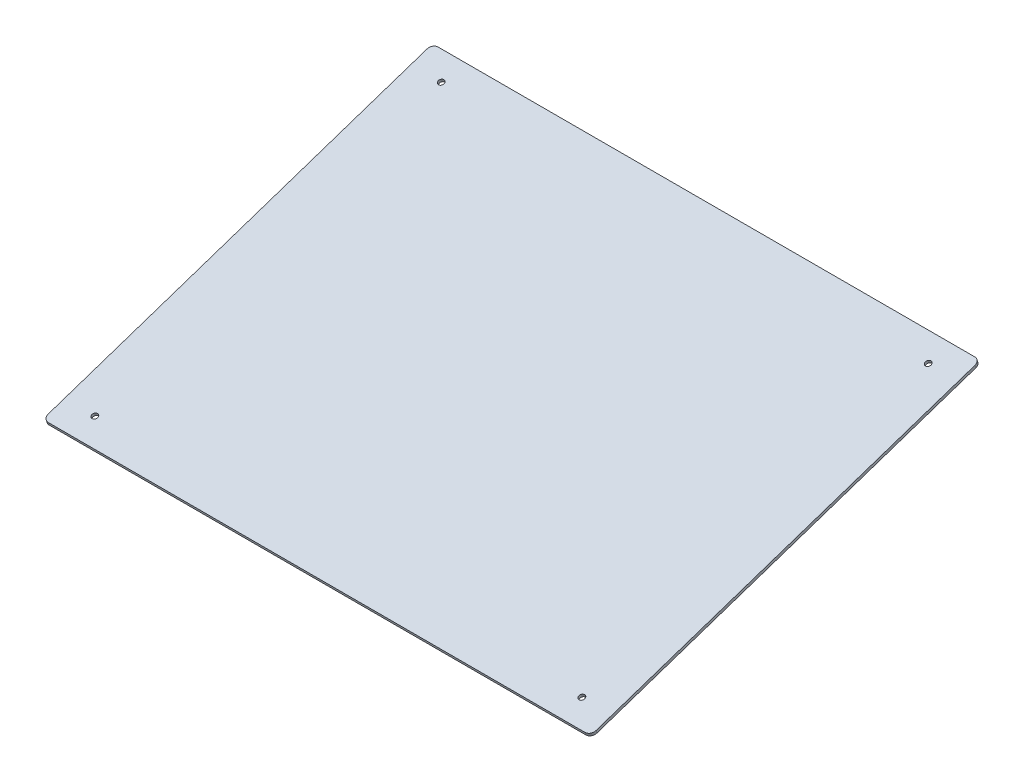
ISO-10303-21;
HEADER;
FILE_DESCRIPTION(('STEP AP214'),'2;1');
FILE_NAME('part.step','',(''),(''),'','','');
FILE_SCHEMA(('AUTOMOTIVE_DESIGN { 1 0 10303 214 1 1 1 1 }'));
ENDSEC;
DATA;
#1=APPLICATION_CONTEXT('core data for automotive mechanical design processes');
#2=APPLICATION_PROTOCOL_DEFINITION('international standard','automotive_design',2000,#1);
#3=PRODUCT_CONTEXT('',#1,'mechanical');
#4=PRODUCT('Part','Part','',(#3));
#5=PRODUCT_RELATED_PRODUCT_CATEGORY('part','',(#4));
#6=PRODUCT_DEFINITION_FORMATION('','',#4);
#7=PRODUCT_DEFINITION_CONTEXT('part definition',#1,'design');
#8=PRODUCT_DEFINITION('design','',#6,#7);
#9=PRODUCT_DEFINITION_SHAPE('','',#8);
#10=(LENGTH_UNIT() NAMED_UNIT(*) SI_UNIT(.MILLI.,.METRE.));
#11=(NAMED_UNIT(*) PLANE_ANGLE_UNIT() SI_UNIT($,.RADIAN.));
#12=(NAMED_UNIT(*) SI_UNIT($,.STERADIAN.) SOLID_ANGLE_UNIT());
#13=UNCERTAINTY_MEASURE_WITH_UNIT(LENGTH_MEASURE(1.E-05),#10,'distance_accuracy_value','');
#14=(GEOMETRIC_REPRESENTATION_CONTEXT(3) GLOBAL_UNCERTAINTY_ASSIGNED_CONTEXT((#13)) GLOBAL_UNIT_ASSIGNED_CONTEXT((#10,
#11,#12)) REPRESENTATION_CONTEXT('',''));
#15=CARTESIAN_POINT('',(0.,0.,0.));
#16=DIRECTION('',(0.,0.,1.));
#17=DIRECTION('',(1.,0.,0.));
#18=AXIS2_PLACEMENT_3D('',#15,#16,#17);
#19=CARTESIAN_POINT('',(304.8,75.5467720594824,-215.779345296051));
#20=DIRECTION('',(0.,0.317304656405086,-0.948323655206201));
#21=DIRECTION('',(0.,0.948323655206201,0.317304656405086));
#22=AXIS2_PLACEMENT_3D('',#19,#20,#21);
#23=PLANE('',#22);
#24=DIRECTION('',(1.,0.,0.));
#25=VECTOR('',#24,1.);
#26=CARTESIAN_POINT('',(304.8,72.5358444542027,-216.786787580138));
#27=LINE('',#26,#25);
#28=CARTESIAN_POINT('',(-298.45,72.5358444542028,-216.786787580138));
#29=VERTEX_POINT('',#28);
#30=CARTESIAN_POINT('',(298.45,72.5358444542027,-216.786787580138));
#31=VERTEX_POINT('',#30);
#32=EDGE_CURVE('E159',#29,#31,#27,.T.);
#33=ORIENTED_EDGE('',*,*,#32,.F.);
#34=DIRECTION('',(0.,-0.948323655206201,-0.317304656405086));
#35=VECTOR('',#34,1.);
#36=CARTESIAN_POINT('',(-298.45,75.5467720594825,-215.779345296052));
#37=LINE('',#36,#35);
#38=CARTESIAN_POINT('',(-298.45,75.5467720594825,-215.779345296052));
#39=VERTEX_POINT('',#38);
#40=EDGE_CURVE('E148',#29,#39,#37,.F.);
#41=ORIENTED_EDGE('',*,*,#40,.T.);
#42=DIRECTION('',(1.,0.,0.));
#43=VECTOR('',#42,1.);
#44=CARTESIAN_POINT('',(304.8,75.5467720594824,-215.779345296051));
#45=LINE('',#44,#43);
#46=CARTESIAN_POINT('',(298.45,75.5467720594824,-215.779345296051));
#47=VERTEX_POINT('',#46);
#48=EDGE_CURVE('E152',#39,#47,#45,.T.);
#49=ORIENTED_EDGE('',*,*,#48,.T.);
#50=DIRECTION('',(0.,-0.948323655206201,-0.317304656405086));
#51=VECTOR('',#50,1.);
#52=CARTESIAN_POINT('',(298.45,75.5467720594824,-215.779345296051));
#53=LINE('',#52,#51);
#54=EDGE_CURVE('E145',#47,#31,#53,.T.);
#55=ORIENTED_EDGE('',*,*,#54,.T.);
#56=EDGE_LOOP('',(#33,#41,#49,#55));
#57=FACE_BOUND('',#56,.T.);
#58=ADVANCED_FACE('F35',(#57),#23,.T.);
#59=CARTESIAN_POINT('',(-304.8,-69.5249168489231,217.794229864224));
#60=DIRECTION('',(-1.,0.,0.));
#61=DIRECTION('',(0.,0.,1.));
#62=AXIS2_PLACEMENT_3D('',#59,#60,#61);
#63=PLANE('',#62);
#64=DIRECTION('',(0.,0.317304656405087,-0.948323655206201));
#65=VECTOR('',#64,1.);
#66=CARTESIAN_POINT('',(-304.8,-72.5358444542027,216.786787580138));
#67=LINE('',#66,#65);
#68=CARTESIAN_POINT('',(-304.8,-70.5209598860304,210.764932369578));
#69=VERTEX_POINT('',#68);
#70=CARTESIAN_POINT('',(-304.8,70.5209598860306,-210.764932369578));
#71=VERTEX_POINT('',#70);
#72=EDGE_CURVE('E118',#69,#71,#67,.T.);
#73=ORIENTED_EDGE('',*,*,#72,.F.);
#74=DIRECTION('',(0.,-0.948323655206201,-0.317304656405086));
#75=VECTOR('',#74,1.);
#76=CARTESIAN_POINT('',(-304.8,-67.5100322807507,211.772374653664));
#77=LINE('',#76,#75);
#78=CARTESIAN_POINT('',(-304.8,-67.5100322807507,211.772374653664));
#79=VERTEX_POINT('',#78);
#80=EDGE_CURVE('E136',#69,#79,#77,.F.);
#81=ORIENTED_EDGE('',*,*,#80,.T.);
#82=DIRECTION('',(0.,0.317304656405087,-0.948323655206201));
#83=VECTOR('',#82,1.);
#84=CARTESIAN_POINT('',(-304.8,-69.5249168489231,217.794229864224));
#85=LINE('',#84,#83);
#86=CARTESIAN_POINT('',(-304.8,73.5318874913102,-209.757490085492));
#87=VERTEX_POINT('',#86);
#88=EDGE_CURVE('E120',#79,#87,#85,.T.);
#89=ORIENTED_EDGE('',*,*,#88,.T.);
#90=DIRECTION('',(0.,-0.948323655206201,-0.317304656405086));
#91=VECTOR('',#90,1.);
#92=CARTESIAN_POINT('',(-304.8,73.5318874913101,-209.757490085492));
#93=LINE('',#92,#91);
#94=EDGE_CURVE('E133',#87,#71,#93,.T.);
#95=ORIENTED_EDGE('',*,*,#94,.T.);
#96=EDGE_LOOP('',(#73,#81,#89,#95));
#97=FACE_BOUND('',#96,.T.);
#98=ADVANCED_FACE('F222',(#97),#63,.T.);
#99=CARTESIAN_POINT('',(304.8,-69.5249168489231,217.794229864224));
#100=DIRECTION('',(0.,-0.317304656405086,0.948323655206201));
#101=DIRECTION('',(0.,-0.948323655206201,-0.317304656405086));
#102=AXIS2_PLACEMENT_3D('',#99,#100,#101);
#103=PLANE('',#102);
#104=DIRECTION('',(-1.,0.,0.));
#105=VECTOR('',#104,1.);
#106=CARTESIAN_POINT('',(304.8,-69.5249168489231,217.794229864224));
#107=LINE('',#106,#105);
#108=CARTESIAN_POINT('',(298.45,-69.5249168489231,217.794229864224));
#109=VERTEX_POINT('',#108);
#110=CARTESIAN_POINT('',(-298.45,-69.5249168489231,217.794229864224));
#111=VERTEX_POINT('',#110);
#112=EDGE_CURVE('E124',#109,#111,#107,.T.);
#113=ORIENTED_EDGE('',*,*,#112,.T.);
#114=DIRECTION('',(0.,-0.948323655206201,-0.317304656405086));
#115=VECTOR('',#114,1.);
#116=CARTESIAN_POINT('',(-298.45,-69.5249168489231,217.794229864224));
#117=LINE('',#116,#115);
#118=CARTESIAN_POINT('',(-298.45,-72.5358444542027,216.786787580138));
#119=VERTEX_POINT('',#118);
#120=EDGE_CURVE('E110',#111,#119,#117,.T.);
#121=ORIENTED_EDGE('',*,*,#120,.T.);
#122=DIRECTION('',(-1.,0.,0.));
#123=VECTOR('',#122,1.);
#124=CARTESIAN_POINT('',(304.8,-72.5358444542028,216.786787580138));
#125=LINE('',#124,#123);
#126=CARTESIAN_POINT('',(298.45,-72.5358444542028,216.786787580138));
#127=VERTEX_POINT('',#126);
#128=EDGE_CURVE('E103',#127,#119,#125,.T.);
#129=ORIENTED_EDGE('',*,*,#128,.F.);
#130=DIRECTION('',(0.,-0.948323655206201,-0.317304656405086));
#131=VECTOR('',#130,1.);
#132=CARTESIAN_POINT('',(298.45,-69.5249168489231,217.794229864224));
#133=LINE('',#132,#131);
#134=EDGE_CURVE('E116',#127,#109,#133,.F.);
#135=ORIENTED_EDGE('',*,*,#134,.T.);
#136=EDGE_LOOP('',(#113,#121,#129,#135));
#137=FACE_BOUND('',#136,.T.);
#138=ADVANCED_FACE('F115',(#137),#103,.T.);
#139=CARTESIAN_POINT('',(304.8,-69.5249168489231,217.794229864224));
#140=DIRECTION('',(1.,0.,0.));
#141=DIRECTION('',(0.,0.,-1.));
#142=AXIS2_PLACEMENT_3D('',#139,#140,#141);
#143=PLANE('',#142);
#144=DIRECTION('',(0.,-0.317304656405087,0.948323655206201));
#145=VECTOR('',#144,1.);
#146=CARTESIAN_POINT('',(304.8,-72.5358444542028,216.786787580138));
#147=LINE('',#146,#145);
#148=CARTESIAN_POINT('',(304.8,70.5209598860306,-210.764932369578));
#149=VERTEX_POINT('',#148);
#150=CARTESIAN_POINT('',(304.8,-70.5209598860305,210.764932369578));
#151=VERTEX_POINT('',#150);
#152=EDGE_CURVE('E104',#149,#151,#147,.T.);
#153=ORIENTED_EDGE('',*,*,#152,.F.);
#154=DIRECTION('',(0.,-0.948323655206201,-0.317304656405086));
#155=VECTOR('',#154,1.);
#156=CARTESIAN_POINT('',(304.8,73.5318874913101,-209.757490085492));
#157=LINE('',#156,#155);
#158=CARTESIAN_POINT('',(304.8,73.5318874913102,-209.757490085492));
#159=VERTEX_POINT('',#158);
#160=EDGE_CURVE('E11',#149,#159,#157,.F.);
#161=ORIENTED_EDGE('',*,*,#160,.T.);
#162=DIRECTION('',(0.,-0.317304656405087,0.948323655206201));
#163=VECTOR('',#162,1.);
#164=CARTESIAN_POINT('',(304.8,-69.5249168489231,217.794229864224));
#165=LINE('',#164,#163);
#166=CARTESIAN_POINT('',(304.8,-67.5100322807508,211.772374653664));
#167=VERTEX_POINT('',#166);
#168=EDGE_CURVE('E150',#159,#167,#165,.T.);
#169=ORIENTED_EDGE('',*,*,#168,.T.);
#170=DIRECTION('',(0.,-0.948323655206201,-0.317304656405086));
#171=VECTOR('',#170,1.);
#172=CARTESIAN_POINT('',(304.8,-67.5100322807508,211.772374653664));
#173=LINE('',#172,#171);
#174=EDGE_CURVE('E43',#167,#151,#173,.T.);
#175=ORIENTED_EDGE('',*,*,#174,.T.);
#176=EDGE_LOOP('',(#153,#161,#169,#175));
#177=FACE_BOUND('',#176,.T.);
#178=ADVANCED_FACE('F149',(#177),#143,.T.);
#179=CARTESIAN_POINT('',(0.,3.01092760527969,1.00744228408615));
#180=DIRECTION('',(0.,-0.948323655206201,-0.317304656405086));
#181=DIRECTION('',(0.,0.317304656405086,-0.948323655206201));
#182=AXIS2_PLACEMENT_3D('',#179,#180,#181);
#183=PLANE('',#182);
#184=CARTESIAN_POINT('',(270.933333333333,67.4872337867933,-191.691924453814));
#185=DIRECTION('',(0.,-0.948323655206201,-0.317304656405086));
#186=DIRECTION('',(0.,-0.317304656405086,0.948323655206201));
#187=AXIS2_PLACEMENT_3D('',#184,#185,#186);
#188=CIRCLE('',#187,3.175);
#189=CARTESIAN_POINT('',(270.933333333333,68.4946760708794,-194.702852059094));
#190=VERTEX_POINT('',#189);
#191=EDGE_CURVE('E181',#190,#190,#188,.T.);
#192=ORIENTED_EDGE('',*,*,#191,.T.);
#193=EDGE_LOOP('',(#192));
#194=FACE_BOUND('',#193,.T.);
#195=CARTESIAN_POINT('',(270.933333333333,-61.4653785762338,193.706809021986));
#196=DIRECTION('',(0.,-0.948323655206201,-0.317304656405086));
#197=DIRECTION('',(0.,-0.317304656405086,0.948323655206201));
#198=AXIS2_PLACEMENT_3D('',#195,#196,#197);
#199=CIRCLE('',#198,3.17500000000024);
#200=CARTESIAN_POINT('',(270.933333333333,-60.4579362921476,190.695881416706));
#201=VERTEX_POINT('',#200);
#202=EDGE_CURVE('E175',#201,#201,#199,.T.);
#203=ORIENTED_EDGE('',*,*,#202,.T.);
#204=EDGE_LOOP('',(#203));
#205=FACE_BOUND('',#204,.T.);
#206=CARTESIAN_POINT('',(-270.933333333333,-61.4653785762338,193.706809021986));
#207=DIRECTION('',(0.,-0.948323655206201,-0.317304656405086));
#208=DIRECTION('',(0.,0.317304656405086,-0.948323655206201));
#209=AXIS2_PLACEMENT_3D('',#206,#207,#208);
#210=CIRCLE('',#209,3.17499999999997);
#211=CARTESIAN_POINT('',(-270.933333333333,-60.4579362921477,190.695881416706));
#212=VERTEX_POINT('',#211);
#213=EDGE_CURVE('E170',#212,#212,#210,.T.);
#214=ORIENTED_EDGE('',*,*,#213,.T.);
#215=EDGE_LOOP('',(#214));
#216=FACE_BOUND('',#215,.T.);
#217=CARTESIAN_POINT('',(-270.933333333333,67.4872337867933,-191.691924453814));
#218=DIRECTION('',(0.,-0.948323655206201,-0.317304656405086));
#219=DIRECTION('',(0.,0.317304656405086,-0.948323655206201));
#220=AXIS2_PLACEMENT_3D('',#217,#218,#219);
#221=CIRCLE('',#220,3.175);
#222=CARTESIAN_POINT('',(-270.933333333333,68.4946760708794,-194.702852059094));
#223=VERTEX_POINT('',#222);
#224=EDGE_CURVE('E162',#223,#223,#221,.T.);
#225=ORIENTED_EDGE('',*,*,#224,.T.);
#226=EDGE_LOOP('',(#225));
#227=FACE_BOUND('',#226,.T.);
#228=ORIENTED_EDGE('',*,*,#88,.F.);
#229=CARTESIAN_POINT('',(-298.45,-67.5100322807507,211.772374653664));
#230=DIRECTION('',(0.,-0.948323655206201,-0.317304656405086));
#231=DIRECTION('',(0.,0.317304656405086,-0.948323655206201));
#232=AXIS2_PLACEMENT_3D('',#229,#230,#231);
#233=CIRCLE('',#232,6.35);
#234=EDGE_CURVE('E143',#79,#111,#233,.F.);
#235=ORIENTED_EDGE('',*,*,#234,.T.);
#236=ORIENTED_EDGE('',*,*,#112,.F.);
#237=CARTESIAN_POINT('',(298.45,-67.5100322807508,211.772374653664));
#238=DIRECTION('',(0.,-0.948323655206201,-0.317304656405086));
#239=DIRECTION('',(0.,0.317304656405086,-0.948323655206201));
#240=AXIS2_PLACEMENT_3D('',#237,#238,#239);
#241=CIRCLE('',#240,6.35);
#242=EDGE_CURVE('E50',#109,#167,#241,.F.);
#243=ORIENTED_EDGE('',*,*,#242,.T.);
#244=ORIENTED_EDGE('',*,*,#168,.F.);
#245=CARTESIAN_POINT('',(298.45,73.5318874913101,-209.757490085492));
#246=DIRECTION('',(0.,-0.948323655206201,-0.317304656405086));
#247=DIRECTION('',(0.,0.317304656405086,-0.948323655206201));
#248=AXIS2_PLACEMENT_3D('',#245,#246,#247);
#249=CIRCLE('',#248,6.35);
#250=EDGE_CURVE('E139',#159,#47,#249,.F.);
#251=ORIENTED_EDGE('',*,*,#250,.T.);
#252=ORIENTED_EDGE('',*,*,#48,.F.);
#253=CARTESIAN_POINT('',(-298.45,73.5318874913102,-209.757490085492));
#254=DIRECTION('',(0.,-0.948323655206201,-0.317304656405086));
#255=DIRECTION('',(0.,0.317304656405086,-0.948323655206201));
#256=AXIS2_PLACEMENT_3D('',#253,#254,#255);
#257=CIRCLE('',#256,6.35);
#258=EDGE_CURVE('E141',#39,#87,#257,.F.);
#259=ORIENTED_EDGE('',*,*,#258,.T.);
#260=EDGE_LOOP('',(#228,#235,#236,#243,#244,#251,#252,#259));
#261=FACE_BOUND('',#260,.T.);
#262=ADVANCED_FACE('F190',(#194,#205,#216,#227,#261),#183,.F.);
#263=CARTESIAN_POINT('',(0.,0.,0.));
#264=DIRECTION('',(0.,-0.948323655206201,-0.317304656405086));
#265=DIRECTION('',(0.,0.317304656405086,-0.948323655206201));
#266=AXIS2_PLACEMENT_3D('',#263,#264,#265);
#267=PLANE('',#266);
#268=CARTESIAN_POINT('',(270.933333333333,64.4763061815136,-192.6993667379));
#269=DIRECTION('',(0.,-0.948323655206201,-0.317304656405086));
#270=DIRECTION('',(0.,-0.317304656405086,0.948323655206201));
#271=AXIS2_PLACEMENT_3D('',#268,#269,#270);
#272=CIRCLE('',#271,3.175);
#273=CARTESIAN_POINT('',(270.933333333333,65.4837484655997,-195.71029434318));
#274=VERTEX_POINT('',#273);
#275=EDGE_CURVE('E184',#274,#274,#272,.T.);
#276=ORIENTED_EDGE('',*,*,#275,.F.);
#277=EDGE_LOOP('',(#276));
#278=FACE_BOUND('',#277,.T.);
#279=CARTESIAN_POINT('',(270.933333333333,-64.4763061815135,192.6993667379));
#280=DIRECTION('',(0.,-0.948323655206201,-0.317304656405086));
#281=DIRECTION('',(0.,-0.317304656405086,0.948323655206201));
#282=AXIS2_PLACEMENT_3D('',#279,#280,#281);
#283=CIRCLE('',#282,3.17500000000024);
#284=CARTESIAN_POINT('',(270.933333333333,-63.4688638974273,189.68843913262));
#285=VERTEX_POINT('',#284);
#286=EDGE_CURVE('E178',#285,#285,#283,.T.);
#287=ORIENTED_EDGE('',*,*,#286,.F.);
#288=EDGE_LOOP('',(#287));
#289=FACE_BOUND('',#288,.T.);
#290=CARTESIAN_POINT('',(-270.933333333333,-64.4763061815135,192.6993667379));
#291=DIRECTION('',(0.,-0.948323655206201,-0.317304656405086));
#292=DIRECTION('',(0.,0.317304656405086,-0.948323655206201));
#293=AXIS2_PLACEMENT_3D('',#290,#291,#292);
#294=CIRCLE('',#293,3.17499999999997);
#295=CARTESIAN_POINT('',(-270.933333333333,-63.4688638974274,189.68843913262));
#296=VERTEX_POINT('',#295);
#297=EDGE_CURVE('E172',#296,#296,#294,.T.);
#298=ORIENTED_EDGE('',*,*,#297,.F.);
#299=EDGE_LOOP('',(#298));
#300=FACE_BOUND('',#299,.T.);
#301=CARTESIAN_POINT('',(-270.933333333333,64.4763061815136,-192.6993667379));
#302=DIRECTION('',(0.,-0.948323655206201,-0.317304656405086));
#303=DIRECTION('',(0.,0.317304656405086,-0.948323655206201));
#304=AXIS2_PLACEMENT_3D('',#301,#302,#303);
#305=CIRCLE('',#304,3.175);
#306=CARTESIAN_POINT('',(-270.933333333333,65.4837484655997,-195.71029434318));
#307=VERTEX_POINT('',#306);
#308=EDGE_CURVE('E165',#307,#307,#305,.T.);
#309=ORIENTED_EDGE('',*,*,#308,.F.);
#310=EDGE_LOOP('',(#309));
#311=FACE_BOUND('',#310,.T.);
#312=ORIENTED_EDGE('',*,*,#128,.T.);
#313=CARTESIAN_POINT('',(-298.45,-70.5209598860304,210.764932369578));
#314=DIRECTION('',(0.,-0.948323655206201,-0.317304656405086));
#315=DIRECTION('',(0.,0.317304656405086,-0.948323655206201));
#316=AXIS2_PLACEMENT_3D('',#313,#314,#315);
#317=CIRCLE('',#316,6.35);
#318=EDGE_CURVE('E131',#119,#69,#317,.T.);
#319=ORIENTED_EDGE('',*,*,#318,.T.);
#320=ORIENTED_EDGE('',*,*,#72,.T.);
#321=CARTESIAN_POINT('',(-298.45,70.5209598860305,-210.764932369578));
#322=DIRECTION('',(0.,-0.948323655206201,-0.317304656405086));
#323=DIRECTION('',(0.,0.317304656405086,-0.948323655206201));
#324=AXIS2_PLACEMENT_3D('',#321,#322,#323);
#325=CIRCLE('',#324,6.35);
#326=EDGE_CURVE('E129',#71,#29,#325,.T.);
#327=ORIENTED_EDGE('',*,*,#326,.T.);
#328=ORIENTED_EDGE('',*,*,#32,.T.);
#329=CARTESIAN_POINT('',(298.45,70.5209598860305,-210.764932369578));
#330=DIRECTION('',(0.,-0.948323655206201,-0.317304656405086));
#331=DIRECTION('',(0.,0.317304656405086,-0.948323655206201));
#332=AXIS2_PLACEMENT_3D('',#329,#330,#331);
#333=CIRCLE('',#332,6.35);
#334=EDGE_CURVE('E109',#31,#149,#333,.T.);
#335=ORIENTED_EDGE('',*,*,#334,.T.);
#336=ORIENTED_EDGE('',*,*,#152,.T.);
#337=CARTESIAN_POINT('',(298.45,-70.5209598860305,210.764932369578));
#338=DIRECTION('',(0.,-0.948323655206201,-0.317304656405086));
#339=DIRECTION('',(0.,0.317304656405086,-0.948323655206201));
#340=AXIS2_PLACEMENT_3D('',#337,#338,#339);
#341=CIRCLE('',#340,6.35);
#342=EDGE_CURVE('E100',#151,#127,#341,.T.);
#343=ORIENTED_EDGE('',*,*,#342,.T.);
#344=EDGE_LOOP('',(#312,#319,#320,#327,#328,#335,#336,#343));
#345=FACE_BOUND('',#344,.T.);
#346=ADVANCED_FACE('F102',(#278,#289,#300,#311,#345),#267,.T.);
#347=CARTESIAN_POINT('',(-270.933333333333,67.4872337867933,-191.691924453814));
#348=DIRECTION('',(0.,-0.948323655206201,-0.317304656405086));
#349=DIRECTION('',(0.,0.317304656405086,-0.948323655206201));
#350=AXIS2_PLACEMENT_3D('',#347,#348,#349);
#351=CYLINDRICAL_SURFACE('',#350,3.175);
#352=CARTESIAN_POINT('',(-270.933333333333,68.4946760708794,-194.702852059094));
#353=CARTESIAN_POINT('',(-270.933333333333,68.4633122416577,-194.713346249553));
#354=CARTESIAN_POINT('',(-270.933333333333,68.4319484124361,-194.723840440012));
#355=CARTESIAN_POINT('',(-270.933333333333,68.3692207539927,-194.744828820931));
#356=CARTESIAN_POINT('',(-270.933333333333,68.3378569247711,-194.75532301139));
#357=CARTESIAN_POINT('',(-270.933333333333,68.2751292663278,-194.776311392308));
#358=CARTESIAN_POINT('',(-270.933333333333,68.2437654371061,-194.786805582768));
#359=CARTESIAN_POINT('',(-270.933333333333,68.1810377786628,-194.807793963686));
#360=CARTESIAN_POINT('',(-270.933333333333,68.1496739494411,-194.818288154145));
#361=CARTESIAN_POINT('',(-270.933333333333,68.0869462909978,-194.839276535064));
#362=CARTESIAN_POINT('',(-270.933333333333,68.0555824617761,-194.849770725523));
#363=CARTESIAN_POINT('',(-270.933333333333,67.9928548033328,-194.870759106441));
#364=CARTESIAN_POINT('',(-270.933333333333,67.9614909741111,-194.881253296901));
#365=CARTESIAN_POINT('',(-270.933333333333,67.8987633156678,-194.902241677819));
#366=CARTESIAN_POINT('',(-270.933333333333,67.8673994864461,-194.912735868278));
#367=CARTESIAN_POINT('',(-270.933333333333,67.8046718280028,-194.933724249197));
#368=CARTESIAN_POINT('',(-270.933333333333,67.7733079987812,-194.944218439656));
#369=CARTESIAN_POINT('',(-270.933333333333,67.7105803403378,-194.965206820574));
#370=CARTESIAN_POINT('',(-270.933333333333,67.6792165111162,-194.975701011034));
#371=CARTESIAN_POINT('',(-270.933333333333,67.6164888526728,-194.996689391952));
#372=CARTESIAN_POINT('',(-270.933333333333,67.5851250234512,-195.007183582411));
#373=CARTESIAN_POINT('',(-270.933333333333,67.5223973650078,-195.02817196333));
#374=CARTESIAN_POINT('',(-270.933333333333,67.4910335357862,-195.038666153789));
#375=CARTESIAN_POINT('',(-270.933333333333,67.4283058773429,-195.059654534708));
#376=CARTESIAN_POINT('',(-270.933333333333,67.3969420481212,-195.070148725167));
#377=CARTESIAN_POINT('',(-270.933333333333,67.3342143896779,-195.091137106085));
#378=CARTESIAN_POINT('',(-270.933333333333,67.3028505604562,-195.101631296544));
#379=CARTESIAN_POINT('',(-270.933333333333,67.2401229020129,-195.122619677463));
#380=CARTESIAN_POINT('',(-270.933333333333,67.2087590727912,-195.133113867922));
#381=CARTESIAN_POINT('',(-270.933333333333,67.1460314143479,-195.154102248841));
#382=CARTESIAN_POINT('',(-270.933333333333,67.1146675851262,-195.1645964393));
#383=CARTESIAN_POINT('',(-270.933333333333,67.0519399266829,-195.185584820218));
#384=CARTESIAN_POINT('',(-270.933333333333,67.0205760974612,-195.196079010678));
#385=CARTESIAN_POINT('',(-270.933333333333,66.9578484390179,-195.217067391596));
#386=CARTESIAN_POINT('',(-270.933333333333,66.9264846097962,-195.227561582055));
#387=CARTESIAN_POINT('',(-270.933333333333,66.8637569513529,-195.248549962974));
#388=CARTESIAN_POINT('',(-270.933333333333,66.8323931221313,-195.259044153433));
#389=CARTESIAN_POINT('',(-270.933333333333,66.7696654636879,-195.280032534351));
#390=CARTESIAN_POINT('',(-270.933333333333,66.7383016344663,-195.290526724811));
#391=CARTESIAN_POINT('',(-270.933333333333,66.6755739760229,-195.311515105729));
#392=CARTESIAN_POINT('',(-270.933333333333,66.6442101468013,-195.322009296188));
#393=CARTESIAN_POINT('',(-270.933333333333,66.5814824883579,-195.342997677107));
#394=CARTESIAN_POINT('',(-270.933333333333,66.5501186591363,-195.353491867566));
#395=CARTESIAN_POINT('',(-270.933333333333,66.487391000693,-195.374480248484));
#396=CARTESIAN_POINT('',(-270.933333333333,66.4560271714713,-195.384974438944));
#397=CARTESIAN_POINT('',(-270.933333333333,66.393299513028,-195.405962819862));
#398=CARTESIAN_POINT('',(-270.933333333333,66.3619356838063,-195.416457010321));
#399=CARTESIAN_POINT('',(-270.933333333333,66.299208025363,-195.43744539124));
#400=CARTESIAN_POINT('',(-270.933333333333,66.2678441961413,-195.447939581699));
#401=CARTESIAN_POINT('',(-270.933333333333,66.205116537698,-195.468927962618));
#402=CARTESIAN_POINT('',(-270.933333333333,66.1737527084763,-195.479422153077));
#403=CARTESIAN_POINT('',(-270.933333333333,66.111025050033,-195.500410533995));
#404=CARTESIAN_POINT('',(-270.933333333333,66.0796612208113,-195.510904724454));
#405=CARTESIAN_POINT('',(-270.933333333333,66.016933562368,-195.531893105373));
#406=CARTESIAN_POINT('',(-270.933333333333,65.9855697331463,-195.542387295832));
#407=CARTESIAN_POINT('',(-270.933333333333,65.922842074703,-195.563375676751));
#408=CARTESIAN_POINT('',(-270.933333333333,65.8914782454814,-195.57386986721));
#409=CARTESIAN_POINT('',(-270.933333333333,65.828750587038,-195.594858248128));
#410=CARTESIAN_POINT('',(-270.933333333333,65.7973867578164,-195.605352438588));
#411=CARTESIAN_POINT('',(-270.933333333333,65.734659099373,-195.626340819506));
#412=CARTESIAN_POINT('',(-270.933333333333,65.7032952701514,-195.636835009965));
#413=CARTESIAN_POINT('',(-270.933333333333,65.640567611708,-195.657823390884));
#414=CARTESIAN_POINT('',(-270.933333333333,65.6092037824864,-195.668317581343));
#415=CARTESIAN_POINT('',(-270.933333333333,65.546476124043,-195.689305962261));
#416=CARTESIAN_POINT('',(-270.933333333333,65.5151122948214,-195.699800152721));
#417=CARTESIAN_POINT('',(-270.933333333333,65.4837484655997,-195.71029434318));
#418=B_SPLINE_CURVE_WITH_KNOTS('',3,(#352,#353,#354,#355,#356,#357,#358,#359,#360,#361,#362,
#363,#364,#365,#366,#367,#368,#369,#370,#371,#372,#373,#374,#375,#376,#377,#378,#379,#380,#381,
#382,#383,#384,#385,#386,#387,#388,#389,#390,#391,#392,#393,#394,#395,#396,#397,#398,#399,#400,
#401,#402,#403,#404,#405,#406,#407,#408,#409,#410,#411,#412,#413,#414,#415,#416,#417),
.UNSPECIFIED.,.F.,.F.,(4,2,2,2,2,2,2,2,2,2,2,2,2,2,2,2,2,2,2,2,2,2,2,2,2,2,2,2,2,2,2,2,4),(0.,
0.0992187499999932,0.1984375,0.297656249999993,0.396874999999999,0.496093749999992,
0.595312499999999,0.694531249999983,0.793749999999989,0.892968749999996,0.992187499999989,
1.09140625,1.19062499999999,1.28984375,1.38906249999999,1.48828124999999,1.5875,
1.68671874999999,1.7859375,1.88515624999998,1.98437499999999,2.08359374999998,2.18281249999999,
2.28203124999998,2.38124999999999,2.48046875,2.57968749999999,2.67890625,2.77812499999999,
2.87734375,2.97656249999999,3.07578124999999,3.17499999999998),.UNSPECIFIED.);
#419=EDGE_CURVE('BSEAM203',#223,#307,#418,.T.);
#420=ORIENTED_EDGE('',*,*,#224,.F.);
#421=ORIENTED_EDGE('',*,*,#308,.T.);
#422=ORIENTED_EDGE('',*,*,#419,.T.);
#423=ORIENTED_EDGE('',*,*,#419,.F.);
#424=EDGE_LOOP('',(#420,#422,#421,#423));
#425=FACE_BOUND('',#424,.T.);
#426=ADVANCED_FACE('F203',(#425),#351,.F.);
#427=CARTESIAN_POINT('',(-270.933333333333,-61.4653785762338,193.706809021986));
#428=DIRECTION('',(0.,-0.948323655206201,-0.317304656405086));
#429=DIRECTION('',(0.,0.317304656405086,-0.948323655206201));
#430=AXIS2_PLACEMENT_3D('',#427,#428,#429);
#431=CYLINDRICAL_SURFACE('',#430,3.17499999999997);
#432=CARTESIAN_POINT('',(-270.933333333333,-60.4579362921477,190.695881416706));
#433=CARTESIAN_POINT('',(-270.933333333333,-60.4893001213694,190.685387226247));
#434=CARTESIAN_POINT('',(-270.933333333333,-60.520663950591,190.674893035788));
#435=CARTESIAN_POINT('',(-270.933333333333,-60.5833916090344,190.65390465487));
#436=CARTESIAN_POINT('',(-270.933333333333,-60.614755438256,190.64341046441));
#437=CARTESIAN_POINT('',(-270.933333333333,-60.6774830966993,190.622422083492));
#438=CARTESIAN_POINT('',(-270.933333333333,-60.708846925921,190.611927893033));
#439=CARTESIAN_POINT('',(-270.933333333333,-60.7715745843643,190.590939512114));
#440=CARTESIAN_POINT('',(-270.933333333333,-60.802938413586,190.580445321655));
#441=CARTESIAN_POINT('',(-270.933333333333,-60.8656660720293,190.559456940736));
#442=CARTESIAN_POINT('',(-270.933333333333,-60.897029901251,190.548962750277));
#443=CARTESIAN_POINT('',(-270.933333333333,-60.9597575596943,190.527974369359));
#444=CARTESIAN_POINT('',(-270.933333333333,-60.991121388916,190.5174801789));
#445=CARTESIAN_POINT('',(-270.933333333333,-61.0538490473593,190.496491797981));
#446=CARTESIAN_POINT('',(-270.933333333333,-61.085212876581,190.485997607522));
#447=CARTESIAN_POINT('',(-270.933333333333,-61.1479405350243,190.465009226603));
#448=CARTESIAN_POINT('',(-270.933333333333,-61.179304364246,190.454515036144));
#449=CARTESIAN_POINT('',(-270.933333333333,-61.2420320226893,190.433526655226));
#450=CARTESIAN_POINT('',(-270.933333333333,-61.2733958519109,190.423032464766));
#451=CARTESIAN_POINT('',(-270.933333333333,-61.3361235103543,190.402044083848));
#452=CARTESIAN_POINT('',(-270.933333333333,-61.3674873395759,190.391549893389));
#453=CARTESIAN_POINT('',(-270.933333333333,-61.4302149980193,190.37056151247));
#454=CARTESIAN_POINT('',(-270.933333333333,-61.4615788272409,190.360067322011));
#455=CARTESIAN_POINT('',(-270.933333333333,-61.5243064856842,190.339078941093));
#456=CARTESIAN_POINT('',(-270.933333333333,-61.5556703149059,190.328584750633));
#457=CARTESIAN_POINT('',(-270.933333333333,-61.6183979733492,190.307596369715));
#458=CARTESIAN_POINT('',(-270.933333333333,-61.6497618025709,190.297102179256));
#459=CARTESIAN_POINT('',(-270.933333333333,-61.7124894610142,190.276113798337));
#460=CARTESIAN_POINT('',(-270.933333333333,-61.7438532902359,190.265619607878));
#461=CARTESIAN_POINT('',(-270.933333333333,-61.8065809486792,190.24463122696));
#462=CARTESIAN_POINT('',(-270.933333333333,-61.8379447779009,190.2341370365));
#463=CARTESIAN_POINT('',(-270.933333333333,-61.9006724363442,190.213148655582));
#464=CARTESIAN_POINT('',(-270.933333333333,-61.9320362655659,190.202654465123));
#465=CARTESIAN_POINT('',(-270.933333333333,-61.9947639240092,190.181666084204));
#466=CARTESIAN_POINT('',(-270.933333333333,-62.0261277532309,190.171171893745));
#467=CARTESIAN_POINT('',(-270.933333333333,-62.0888554116742,190.150183512826));
#468=CARTESIAN_POINT('',(-270.933333333333,-62.1202192408959,190.139689322367));
#469=CARTESIAN_POINT('',(-270.933333333333,-62.1829468993392,190.118700941449));
#470=CARTESIAN_POINT('',(-270.933333333333,-62.2143107285609,190.10820675099));
#471=CARTESIAN_POINT('',(-270.933333333333,-62.2770383870042,190.087218370071));
#472=CARTESIAN_POINT('',(-270.933333333333,-62.3084022162258,190.076724179612));
#473=CARTESIAN_POINT('',(-270.933333333333,-62.3711298746692,190.055735798693));
#474=CARTESIAN_POINT('',(-270.933333333333,-62.4024937038908,190.045241608234));
#475=CARTESIAN_POINT('',(-270.933333333333,-62.4652213623342,190.024253227316));
#476=CARTESIAN_POINT('',(-270.933333333333,-62.4965851915558,190.013759036856));
#477=CARTESIAN_POINT('',(-270.933333333333,-62.5593128499991,189.992770655938));
#478=CARTESIAN_POINT('',(-270.933333333333,-62.5906766792208,189.982276465479));
#479=CARTESIAN_POINT('',(-270.933333333333,-62.6534043376641,189.96128808456));
#480=CARTESIAN_POINT('',(-270.933333333333,-62.6847681668858,189.950793894101));
#481=CARTESIAN_POINT('',(-270.933333333333,-62.7474958253291,189.929805513183));
#482=CARTESIAN_POINT('',(-270.933333333333,-62.7788596545508,189.919311322723));
#483=CARTESIAN_POINT('',(-270.933333333333,-62.8415873129941,189.898322941805));
#484=CARTESIAN_POINT('',(-270.933333333333,-62.8729511422158,189.887828751346));
#485=CARTESIAN_POINT('',(-270.933333333333,-62.9356788006591,189.866840370427));
#486=CARTESIAN_POINT('',(-270.933333333333,-62.9670426298808,189.856346179968));
#487=CARTESIAN_POINT('',(-270.933333333333,-63.0297702883241,189.83535779905));
#488=CARTESIAN_POINT('',(-270.933333333333,-63.0611341175458,189.82486360859));
#489=CARTESIAN_POINT('',(-270.933333333333,-63.1238617759891,189.803875227672));
#490=CARTESIAN_POINT('',(-270.933333333333,-63.1552256052108,189.793381037213));
#491=CARTESIAN_POINT('',(-270.933333333333,-63.2179532636541,189.772392656294));
#492=CARTESIAN_POINT('',(-270.933333333333,-63.2493170928757,189.761898465835));
#493=CARTESIAN_POINT('',(-270.933333333333,-63.3120447513191,189.740910084916));
#494=CARTESIAN_POINT('',(-270.933333333333,-63.3434085805407,189.730415894457));
#495=CARTESIAN_POINT('',(-270.933333333333,-63.4061362389841,189.709427513539));
#496=CARTESIAN_POINT('',(-270.933333333333,-63.4375000682057,189.69893332308));
#497=CARTESIAN_POINT('',(-270.933333333333,-63.4688638974274,189.68843913262));
#498=B_SPLINE_CURVE_WITH_KNOTS('',3,(#432,#433,#434,#435,#436,#437,#438,#439,#440,#441,#442,
#443,#444,#445,#446,#447,#448,#449,#450,#451,#452,#453,#454,#455,#456,#457,#458,#459,#460,#461,
#462,#463,#464,#465,#466,#467,#468,#469,#470,#471,#472,#473,#474,#475,#476,#477,#478,#479,#480,
#481,#482,#483,#484,#485,#486,#487,#488,#489,#490,#491,#492,#493,#494,#495,#496,#497),
.UNSPECIFIED.,.F.,.F.,(4,2,2,2,2,2,2,2,2,2,2,2,2,2,2,2,2,2,2,2,2,2,2,2,2,2,2,2,2,2,2,2,4),(0.,
0.0992187499999998,0.1984375,0.297656249999999,0.396874999999999,0.496093749999999,
0.595312500000005,0.694531249999996,0.793749999999996,0.892968749999996,0.992187499999996,
1.09140625,1.190625,1.28984375,1.3890625,1.48828125,1.5875,1.68671875,1.78593750000001,
1.88515625,1.984375,2.08359375,2.1828125,2.28203125,2.38125,2.48046875,2.5796875,
2.67890625000001,2.778125,2.87734375000001,2.9765625,3.07578125,3.17500000000001),.UNSPECIFIED.);
#499=EDGE_CURVE('BSEAM212',#212,#296,#498,.T.);
#500=ORIENTED_EDGE('',*,*,#213,.F.);
#501=ORIENTED_EDGE('',*,*,#297,.T.);
#502=ORIENTED_EDGE('',*,*,#499,.T.);
#503=ORIENTED_EDGE('',*,*,#499,.F.);
#504=EDGE_LOOP('',(#500,#502,#501,#503));
#505=FACE_BOUND('',#504,.T.);
#506=ADVANCED_FACE('F212',(#505),#431,.F.);
#507=CARTESIAN_POINT('',(270.933333333333,-61.4653785762338,193.706809021986));
#508=DIRECTION('',(0.,-0.948323655206201,-0.317304656405086));
#509=DIRECTION('',(0.,0.317304656405086,-0.948323655206201));
#510=AXIS2_PLACEMENT_3D('',#507,#508,#509);
#511=CYLINDRICAL_SURFACE('',#510,3.17500000000024);
#512=CARTESIAN_POINT('',(270.933333333333,-60.4579362921476,190.695881416706));
#513=CARTESIAN_POINT('',(270.933333333333,-60.4893001213693,190.685387226247));
#514=CARTESIAN_POINT('',(270.933333333333,-60.520663950591,190.674893035788));
#515=CARTESIAN_POINT('',(270.933333333333,-60.5833916090343,190.653904654869));
#516=CARTESIAN_POINT('',(270.933333333333,-60.6147554382559,190.64341046441));
#517=CARTESIAN_POINT('',(270.933333333333,-60.6774830966993,190.622422083492));
#518=CARTESIAN_POINT('',(270.933333333333,-60.7088469259209,190.611927893032));
#519=CARTESIAN_POINT('',(270.933333333333,-60.7715745843643,190.590939512114));
#520=CARTESIAN_POINT('',(270.933333333333,-60.8029384135859,190.580445321655));
#521=CARTESIAN_POINT('',(270.933333333333,-60.8656660720292,190.559456940736));
#522=CARTESIAN_POINT('',(270.933333333333,-60.8970299012509,190.548962750277));
#523=CARTESIAN_POINT('',(270.933333333333,-60.9597575596942,190.527974369359));
#524=CARTESIAN_POINT('',(270.933333333333,-60.9911213889159,190.517480178899));
#525=CARTESIAN_POINT('',(270.933333333333,-61.0538490473592,190.496491797981));
#526=CARTESIAN_POINT('',(270.933333333333,-61.0852128765809,190.485997607522));
#527=CARTESIAN_POINT('',(270.933333333333,-61.1479405350242,190.465009226603));
#528=CARTESIAN_POINT('',(270.933333333333,-61.1793043642459,190.454515036144));
#529=CARTESIAN_POINT('',(270.933333333333,-61.2420320226892,190.433526655226));
#530=CARTESIAN_POINT('',(270.933333333333,-61.2733958519109,190.423032464766));
#531=CARTESIAN_POINT('',(270.933333333333,-61.3361235103542,190.402044083848));
#532=CARTESIAN_POINT('',(270.933333333333,-61.3674873395759,190.391549893389));
#533=CARTESIAN_POINT('',(270.933333333333,-61.4302149980192,190.37056151247));
#534=CARTESIAN_POINT('',(270.933333333333,-61.4615788272409,190.360067322011));
#535=CARTESIAN_POINT('',(270.933333333333,-61.5243064856842,190.339078941092));
#536=CARTESIAN_POINT('',(270.933333333333,-61.5556703149059,190.328584750633));
#537=CARTESIAN_POINT('',(270.933333333333,-61.6183979733492,190.307596369715));
#538=CARTESIAN_POINT('',(270.933333333333,-61.6497618025708,190.297102179255));
#539=CARTESIAN_POINT('',(270.933333333333,-61.7124894610142,190.276113798337));
#540=CARTESIAN_POINT('',(270.933333333333,-61.7438532902358,190.265619607878));
#541=CARTESIAN_POINT('',(270.933333333333,-61.8065809486792,190.244631226959));
#542=CARTESIAN_POINT('',(270.933333333333,-61.8379447779008,190.2341370365));
#543=CARTESIAN_POINT('',(270.933333333333,-61.9006724363441,190.213148655582));
#544=CARTESIAN_POINT('',(270.933333333333,-61.9320362655658,190.202654465122));
#545=CARTESIAN_POINT('',(270.933333333333,-61.9947639240091,190.181666084204));
#546=CARTESIAN_POINT('',(270.933333333333,-62.0261277532308,190.171171893745));
#547=CARTESIAN_POINT('',(270.933333333333,-62.0888554116741,190.150183512826));
#548=CARTESIAN_POINT('',(270.933333333333,-62.1202192408958,190.139689322367));
#549=CARTESIAN_POINT('',(270.933333333333,-62.1829468993391,190.118700941449));
#550=CARTESIAN_POINT('',(270.933333333333,-62.2143107285608,190.108206750989));
#551=CARTESIAN_POINT('',(270.933333333333,-62.2770383870041,190.087218370071));
#552=CARTESIAN_POINT('',(270.933333333333,-62.3084022162258,190.076724179612));
#553=CARTESIAN_POINT('',(270.933333333333,-62.3711298746691,190.055735798693));
#554=CARTESIAN_POINT('',(270.933333333333,-62.4024937038908,190.045241608234));
#555=CARTESIAN_POINT('',(270.933333333333,-62.4652213623341,190.024253227316));
#556=CARTESIAN_POINT('',(270.933333333333,-62.4965851915558,190.013759036856));
#557=CARTESIAN_POINT('',(270.933333333333,-62.5593128499991,189.992770655938));
#558=CARTESIAN_POINT('',(270.933333333333,-62.5906766792207,189.982276465479));
#559=CARTESIAN_POINT('',(270.933333333333,-62.6534043376641,189.96128808456));
#560=CARTESIAN_POINT('',(270.933333333333,-62.6847681668857,189.950793894101));
#561=CARTESIAN_POINT('',(270.933333333333,-62.7474958253291,189.929805513182));
#562=CARTESIAN_POINT('',(270.933333333333,-62.7788596545507,189.919311322723));
#563=CARTESIAN_POINT('',(270.933333333333,-62.8415873129941,189.898322941805));
#564=CARTESIAN_POINT('',(270.933333333333,-62.8729511422157,189.887828751345));
#565=CARTESIAN_POINT('',(270.933333333333,-62.935678800659,189.866840370427));
#566=CARTESIAN_POINT('',(270.933333333333,-62.9670426298807,189.856346179968));
#567=CARTESIAN_POINT('',(270.933333333333,-63.029770288324,189.835357799049));
#568=CARTESIAN_POINT('',(270.933333333333,-63.0611341175457,189.82486360859));
#569=CARTESIAN_POINT('',(270.933333333333,-63.123861775989,189.803875227672));
#570=CARTESIAN_POINT('',(270.933333333333,-63.1552256052107,189.793381037212));
#571=CARTESIAN_POINT('',(270.933333333333,-63.217953263654,189.772392656294));
#572=CARTESIAN_POINT('',(270.933333333333,-63.2493170928757,189.761898465835));
#573=CARTESIAN_POINT('',(270.933333333333,-63.312044751319,189.740910084916));
#574=CARTESIAN_POINT('',(270.933333333333,-63.3434085805407,189.730415894457));
#575=CARTESIAN_POINT('',(270.933333333333,-63.406136238984,189.709427513539));
#576=CARTESIAN_POINT('',(270.933333333333,-63.4375000682057,189.698933323079));
#577=CARTESIAN_POINT('',(270.933333333333,-63.4688638974273,189.68843913262));
#578=B_SPLINE_CURVE_WITH_KNOTS('',3,(#512,#513,#514,#515,#516,#517,#518,#519,#520,#521,#522,
#523,#524,#525,#526,#527,#528,#529,#530,#531,#532,#533,#534,#535,#536,#537,#538,#539,#540,#541,
#542,#543,#544,#545,#546,#547,#548,#549,#550,#551,#552,#553,#554,#555,#556,#557,#558,#559,#560,
#561,#562,#563,#564,#565,#566,#567,#568,#569,#570,#571,#572,#573,#574,#575,#576,#577),
.UNSPECIFIED.,.F.,.F.,(4,2,2,2,2,2,2,2,2,2,2,2,2,2,2,2,2,2,2,2,2,2,2,2,2,2,2,2,2,2,2,2,4),(0.,
0.0992187499999998,0.1984375,0.297656249999999,0.396874999999999,0.496093749999999,
0.595312500000005,0.694531249999996,0.793749999999996,0.892968749999996,0.992187499999996,
1.09140625,1.190625,1.28984375,1.3890625,1.48828125,1.5875,1.68671875,1.78593750000001,
1.88515625,1.984375,2.08359375,2.1828125,2.28203125,2.38125,2.48046875,2.5796875,
2.67890625000001,2.778125,2.87734375000001,2.9765625,3.07578125,3.17499999999999),.UNSPECIFIED.);
#579=EDGE_CURVE('BSEAM197',#201,#285,#578,.T.);
#580=ORIENTED_EDGE('',*,*,#202,.F.);
#581=ORIENTED_EDGE('',*,*,#286,.T.);
#582=ORIENTED_EDGE('',*,*,#579,.T.);
#583=ORIENTED_EDGE('',*,*,#579,.F.);
#584=EDGE_LOOP('',(#580,#582,#581,#583));
#585=FACE_BOUND('',#584,.T.);
#586=ADVANCED_FACE('F197',(#585),#511,.F.);
#587=CARTESIAN_POINT('',(270.933333333333,67.4872337867933,-191.691924453814));
#588=DIRECTION('',(0.,-0.948323655206201,-0.317304656405086));
#589=DIRECTION('',(0.,0.317304656405086,-0.948323655206201));
#590=AXIS2_PLACEMENT_3D('',#587,#588,#589);
#591=CYLINDRICAL_SURFACE('',#590,3.175);
#592=CARTESIAN_POINT('',(270.933333333333,68.4946760708794,-194.702852059094));
#593=CARTESIAN_POINT('',(270.933333333333,68.4633122416577,-194.713346249553));
#594=CARTESIAN_POINT('',(270.933333333333,68.4319484124361,-194.723840440012));
#595=CARTESIAN_POINT('',(270.933333333333,68.3692207539927,-194.744828820931));
#596=CARTESIAN_POINT('',(270.933333333333,68.3378569247711,-194.75532301139));
#597=CARTESIAN_POINT('',(270.933333333333,68.2751292663278,-194.776311392308));
#598=CARTESIAN_POINT('',(270.933333333333,68.2437654371061,-194.786805582767));
#599=CARTESIAN_POINT('',(270.933333333333,68.1810377786628,-194.807793963686));
#600=CARTESIAN_POINT('',(270.933333333333,68.1496739494411,-194.818288154145));
#601=CARTESIAN_POINT('',(270.933333333333,68.0869462909978,-194.839276535064));
#602=CARTESIAN_POINT('',(270.933333333333,68.0555824617761,-194.849770725523));
#603=CARTESIAN_POINT('',(270.933333333333,67.9928548033328,-194.870759106441));
#604=CARTESIAN_POINT('',(270.933333333333,67.9614909741111,-194.881253296901));
#605=CARTESIAN_POINT('',(270.933333333333,67.8987633156678,-194.902241677819));
#606=CARTESIAN_POINT('',(270.933333333333,67.8673994864461,-194.912735868278));
#607=CARTESIAN_POINT('',(270.933333333333,67.8046718280028,-194.933724249197));
#608=CARTESIAN_POINT('',(270.933333333333,67.7733079987811,-194.944218439656));
#609=CARTESIAN_POINT('',(270.933333333333,67.7105803403378,-194.965206820574));
#610=CARTESIAN_POINT('',(270.933333333333,67.6792165111162,-194.975701011034));
#611=CARTESIAN_POINT('',(270.933333333333,67.6164888526728,-194.996689391952));
#612=CARTESIAN_POINT('',(270.933333333333,67.5851250234512,-195.007183582411));
#613=CARTESIAN_POINT('',(270.933333333333,67.5223973650078,-195.02817196333));
#614=CARTESIAN_POINT('',(270.933333333333,67.4910335357862,-195.038666153789));
#615=CARTESIAN_POINT('',(270.933333333333,67.4283058773429,-195.059654534708));
#616=CARTESIAN_POINT('',(270.933333333333,67.3969420481212,-195.070148725167));
#617=CARTESIAN_POINT('',(270.933333333333,67.3342143896779,-195.091137106085));
#618=CARTESIAN_POINT('',(270.933333333333,67.3028505604562,-195.101631296544));
#619=CARTESIAN_POINT('',(270.933333333333,67.2401229020129,-195.122619677463));
#620=CARTESIAN_POINT('',(270.933333333333,67.2087590727912,-195.133113867922));
#621=CARTESIAN_POINT('',(270.933333333333,67.1460314143479,-195.154102248841));
#622=CARTESIAN_POINT('',(270.933333333333,67.1146675851262,-195.1645964393));
#623=CARTESIAN_POINT('',(270.933333333333,67.0519399266829,-195.185584820218));
#624=CARTESIAN_POINT('',(270.933333333333,67.0205760974612,-195.196079010678));
#625=CARTESIAN_POINT('',(270.933333333333,66.9578484390179,-195.217067391596));
#626=CARTESIAN_POINT('',(270.933333333333,66.9264846097962,-195.227561582055));
#627=CARTESIAN_POINT('',(270.933333333333,66.8637569513529,-195.248549962974));
#628=CARTESIAN_POINT('',(270.933333333333,66.8323931221312,-195.259044153433));
#629=CARTESIAN_POINT('',(270.933333333333,66.7696654636879,-195.280032534351));
#630=CARTESIAN_POINT('',(270.933333333333,66.7383016344662,-195.290526724811));
#631=CARTESIAN_POINT('',(270.933333333333,66.6755739760229,-195.311515105729));
#632=CARTESIAN_POINT('',(270.933333333333,66.6442101468013,-195.322009296188));
#633=CARTESIAN_POINT('',(270.933333333333,66.5814824883579,-195.342997677107));
#634=CARTESIAN_POINT('',(270.933333333333,66.5501186591363,-195.353491867566));
#635=CARTESIAN_POINT('',(270.933333333333,66.4873910006929,-195.374480248484));
#636=CARTESIAN_POINT('',(270.933333333333,66.4560271714713,-195.384974438944));
#637=CARTESIAN_POINT('',(270.933333333333,66.393299513028,-195.405962819862));
#638=CARTESIAN_POINT('',(270.933333333333,66.3619356838063,-195.416457010321));
#639=CARTESIAN_POINT('',(270.933333333333,66.299208025363,-195.43744539124));
#640=CARTESIAN_POINT('',(270.933333333333,66.2678441961413,-195.447939581699));
#641=CARTESIAN_POINT('',(270.933333333333,66.205116537698,-195.468927962617));
#642=CARTESIAN_POINT('',(270.933333333333,66.1737527084763,-195.479422153077));
#643=CARTESIAN_POINT('',(270.933333333333,66.111025050033,-195.500410533995));
#644=CARTESIAN_POINT('',(270.933333333333,66.0796612208113,-195.510904724454));
#645=CARTESIAN_POINT('',(270.933333333333,66.016933562368,-195.531893105373));
#646=CARTESIAN_POINT('',(270.933333333333,65.9855697331463,-195.542387295832));
#647=CARTESIAN_POINT('',(270.933333333333,65.922842074703,-195.563375676751));
#648=CARTESIAN_POINT('',(270.933333333333,65.8914782454813,-195.57386986721));
#649=CARTESIAN_POINT('',(270.933333333333,65.828750587038,-195.594858248128));
#650=CARTESIAN_POINT('',(270.933333333333,65.7973867578164,-195.605352438588));
#651=CARTESIAN_POINT('',(270.933333333333,65.734659099373,-195.626340819506));
#652=CARTESIAN_POINT('',(270.933333333333,65.7032952701514,-195.636835009965));
#653=CARTESIAN_POINT('',(270.933333333333,65.640567611708,-195.657823390884));
#654=CARTESIAN_POINT('',(270.933333333333,65.6092037824864,-195.668317581343));
#655=CARTESIAN_POINT('',(270.933333333333,65.546476124043,-195.689305962261));
#656=CARTESIAN_POINT('',(270.933333333333,65.5151122948214,-195.699800152721));
#657=CARTESIAN_POINT('',(270.933333333333,65.4837484655997,-195.71029434318));
#658=B_SPLINE_CURVE_WITH_KNOTS('',3,(#592,#593,#594,#595,#596,#597,#598,#599,#600,#601,#602,
#603,#604,#605,#606,#607,#608,#609,#610,#611,#612,#613,#614,#615,#616,#617,#618,#619,#620,#621,
#622,#623,#624,#625,#626,#627,#628,#629,#630,#631,#632,#633,#634,#635,#636,#637,#638,#639,#640,
#641,#642,#643,#644,#645,#646,#647,#648,#649,#650,#651,#652,#653,#654,#655,#656,#657),
.UNSPECIFIED.,.F.,.F.,(4,2,2,2,2,2,2,2,2,2,2,2,2,2,2,2,2,2,2,2,2,2,2,2,2,2,2,2,2,2,2,2,4),(0.,
0.0992187499999932,0.1984375,0.297656249999993,0.396874999999999,0.496093749999992,
0.595312499999999,0.694531249999983,0.793749999999989,0.892968749999996,0.992187499999989,
1.09140625,1.19062499999999,1.28984375,1.38906249999999,1.48828124999999,1.5875,
1.68671874999999,1.7859375,1.88515624999998,1.98437499999999,2.08359374999998,2.18281249999999,
2.28203124999998,2.38124999999999,2.48046875,2.57968749999999,2.67890625,2.77812499999999,
2.87734375,2.97656249999999,3.07578124999999,3.17499999999999),.UNSPECIFIED.);
#659=EDGE_CURVE('BSEAM193',#190,#274,#658,.T.);
#660=ORIENTED_EDGE('',*,*,#191,.F.);
#661=ORIENTED_EDGE('',*,*,#275,.T.);
#662=ORIENTED_EDGE('',*,*,#659,.T.);
#663=ORIENTED_EDGE('',*,*,#659,.F.);
#664=EDGE_LOOP('',(#660,#662,#661,#663));
#665=FACE_BOUND('',#664,.T.);
#666=ADVANCED_FACE('F193',(#665),#591,.F.);
#667=CARTESIAN_POINT('',(-298.45,-67.5100322807507,211.772374653664));
#668=DIRECTION('',(0.,-0.948323655206201,-0.317304656405086));
#669=DIRECTION('',(0.,0.317304656405086,-0.948323655206201));
#670=AXIS2_PLACEMENT_3D('',#667,#668,#669);
#671=CYLINDRICAL_SURFACE('',#670,6.35);
#672=ORIENTED_EDGE('',*,*,#234,.F.);
#673=ORIENTED_EDGE('',*,*,#80,.F.);
#674=ORIENTED_EDGE('',*,*,#318,.F.);
#675=ORIENTED_EDGE('',*,*,#120,.F.);
#676=EDGE_LOOP('',(#672,#673,#674,#675));
#677=FACE_BOUND('',#676,.T.);
#678=ADVANCED_FACE('F196',(#677),#671,.T.);
#679=CARTESIAN_POINT('',(-298.45,73.5318874913101,-209.757490085492));
#680=DIRECTION('',(0.,-0.948323655206201,-0.317304656405086));
#681=DIRECTION('',(0.,0.317304656405086,-0.948323655206201));
#682=AXIS2_PLACEMENT_3D('',#679,#680,#681);
#683=CYLINDRICAL_SURFACE('',#682,6.35);
#684=ORIENTED_EDGE('',*,*,#258,.F.);
#685=ORIENTED_EDGE('',*,*,#40,.F.);
#686=ORIENTED_EDGE('',*,*,#326,.F.);
#687=ORIENTED_EDGE('',*,*,#94,.F.);
#688=EDGE_LOOP('',(#684,#685,#686,#687));
#689=FACE_BOUND('',#688,.T.);
#690=ADVANCED_FACE('F235',(#689),#683,.T.);
#691=CARTESIAN_POINT('',(298.45,73.5318874913101,-209.757490085492));
#692=DIRECTION('',(0.,-0.948323655206201,-0.317304656405086));
#693=DIRECTION('',(0.,0.317304656405086,-0.948323655206201));
#694=AXIS2_PLACEMENT_3D('',#691,#692,#693);
#695=CYLINDRICAL_SURFACE('',#694,6.35);
#696=ORIENTED_EDGE('',*,*,#250,.F.);
#697=ORIENTED_EDGE('',*,*,#160,.F.);
#698=ORIENTED_EDGE('',*,*,#334,.F.);
#699=ORIENTED_EDGE('',*,*,#54,.F.);
#700=EDGE_LOOP('',(#696,#697,#698,#699));
#701=FACE_BOUND('',#700,.T.);
#702=ADVANCED_FACE('F238',(#701),#695,.T.);
#703=CARTESIAN_POINT('',(298.45,-67.5100322807508,211.772374653664));
#704=DIRECTION('',(0.,-0.948323655206201,-0.317304656405086));
#705=DIRECTION('',(0.,0.317304656405086,-0.948323655206201));
#706=AXIS2_PLACEMENT_3D('',#703,#704,#705);
#707=CYLINDRICAL_SURFACE('',#706,6.35);
#708=ORIENTED_EDGE('',*,*,#242,.F.);
#709=ORIENTED_EDGE('',*,*,#134,.F.);
#710=ORIENTED_EDGE('',*,*,#342,.F.);
#711=ORIENTED_EDGE('',*,*,#174,.F.);
#712=EDGE_LOOP('',(#708,#709,#710,#711));
#713=FACE_BOUND('',#712,.T.);
#714=ADVANCED_FACE('F37',(#713),#707,.T.);
#715=CLOSED_SHELL('',(#58,#98,#138,#178,#262,#346,#426,#506,#586,#666,#678,#690,#702,#714));
#716=MANIFOLD_SOLID_BREP('B2',#715);
#717=ADVANCED_BREP_SHAPE_REPRESENTATION('',(#18,#716),#14);
#718=SHAPE_DEFINITION_REPRESENTATION(#9,#717);
ENDSEC;
END-ISO-10303-21;
